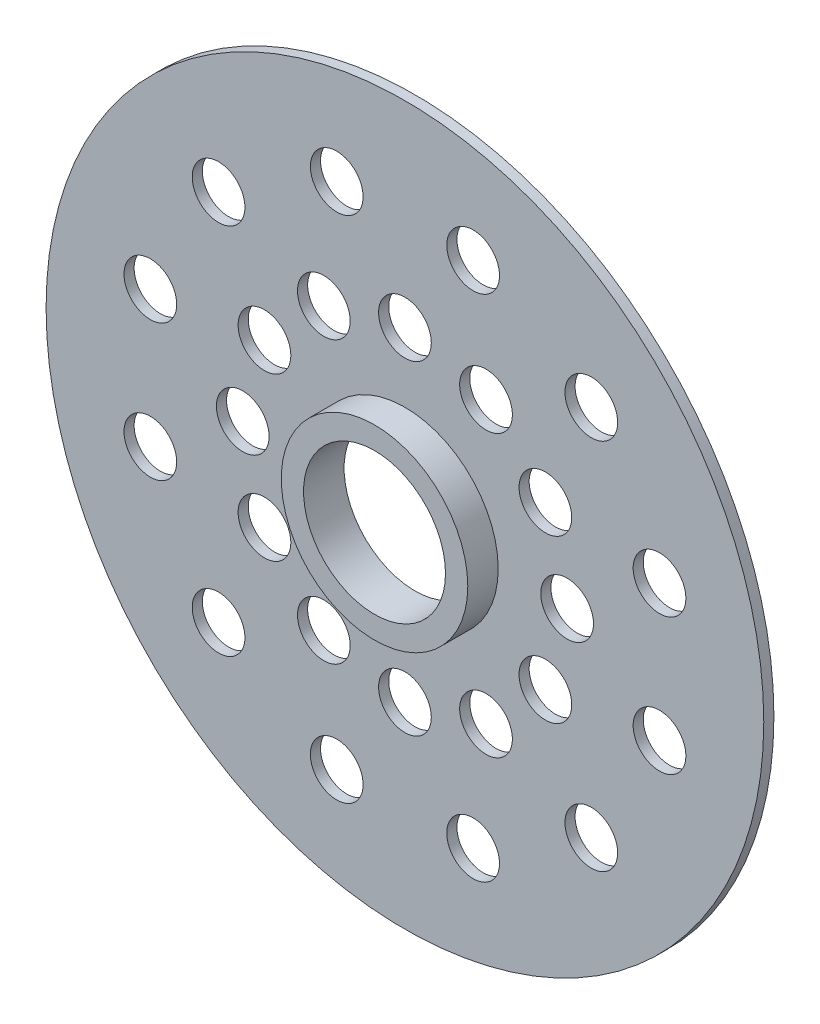
ISO-10303-21;
HEADER;
FILE_DESCRIPTION(('STEP AP214'),'2;1');
FILE_NAME('part.step','',(''),(''),'','','');
FILE_SCHEMA(('AUTOMOTIVE_DESIGN { 1 0 10303 214 1 1 1 1 }'));
ENDSEC;
DATA;
#1=APPLICATION_CONTEXT('core data for automotive mechanical design processes');
#2=APPLICATION_PROTOCOL_DEFINITION('international standard','automotive_design',2000,#1);
#3=PRODUCT_CONTEXT('',#1,'mechanical');
#4=PRODUCT('Part','Part','',(#3));
#5=PRODUCT_RELATED_PRODUCT_CATEGORY('part','',(#4));
#6=PRODUCT_DEFINITION_FORMATION('','',#4);
#7=PRODUCT_DEFINITION_CONTEXT('part definition',#1,'design');
#8=PRODUCT_DEFINITION('design','',#6,#7);
#9=PRODUCT_DEFINITION_SHAPE('','',#8);
#10=(LENGTH_UNIT() NAMED_UNIT(*) SI_UNIT(.MILLI.,.METRE.));
#11=(NAMED_UNIT(*) PLANE_ANGLE_UNIT() SI_UNIT($,.RADIAN.));
#12=(NAMED_UNIT(*) SI_UNIT($,.STERADIAN.) SOLID_ANGLE_UNIT());
#13=UNCERTAINTY_MEASURE_WITH_UNIT(LENGTH_MEASURE(1.E-05),#10,'distance_accuracy_value','');
#14=(GEOMETRIC_REPRESENTATION_CONTEXT(3) GLOBAL_UNCERTAINTY_ASSIGNED_CONTEXT((#13)) GLOBAL_UNIT_ASSIGNED_CONTEXT((#10,
#11,#12)) REPRESENTATION_CONTEXT('',''));
#15=CARTESIAN_POINT('',(0.,0.,0.));
#16=DIRECTION('',(0.,0.,1.));
#17=DIRECTION('',(1.,0.,0.));
#18=AXIS2_PLACEMENT_3D('',#15,#16,#17);
#19=CARTESIAN_POINT('',(0.,0.,-39.5));
#20=DIRECTION('',(0.,0.,1.));
#21=DIRECTION('',(1.,0.,0.));
#22=AXIS2_PLACEMENT_3D('',#19,#20,#21);
#23=PLANE('',#22);
#24=CARTESIAN_POINT('',(-45.9619407771256,45.9619407771256,-39.5));
#25=DIRECTION('',(0.,0.,1.));
#26=DIRECTION('',(1.,0.,0.));
#27=AXIS2_PLACEMENT_3D('',#24,#25,#26);
#28=CIRCLE('',#27,6.5);
#29=CARTESIAN_POINT('',(-39.4619407771256,45.9619407771256,-39.5));
#30=VERTEX_POINT('',#29);
#31=EDGE_CURVE('E184',#30,#30,#28,.T.);
#32=ORIENTED_EDGE('',*,*,#31,.F.);
#33=EDGE_LOOP('',(#32));
#34=FACE_BOUND('',#33,.T.);
#35=CARTESIAN_POINT('',(-16.8232379316639,62.7851787087894,-39.5));
#36=DIRECTION('',(0.,0.,1.));
#37=DIRECTION('',(1.,0.,0.));
#38=AXIS2_PLACEMENT_3D('',#35,#36,#37);
#39=CIRCLE('',#38,6.5);
#40=CARTESIAN_POINT('',(-10.3232379316639,62.7851787087894,-39.5));
#41=VERTEX_POINT('',#40);
#42=EDGE_CURVE('E168',#41,#41,#39,.T.);
#43=ORIENTED_EDGE('',*,*,#42,.F.);
#44=EDGE_LOOP('',(#43));
#45=FACE_BOUND('',#44,.T.);
#46=CARTESIAN_POINT('',(16.8232379316638,62.7851787087894,-39.5));
#47=DIRECTION('',(0.,0.,1.));
#48=DIRECTION('',(1.,0.,0.));
#49=AXIS2_PLACEMENT_3D('',#46,#47,#48);
#50=CIRCLE('',#49,6.5);
#51=CARTESIAN_POINT('',(23.3232379316638,62.7851787087894,-39.5));
#52=VERTEX_POINT('',#51);
#53=EDGE_CURVE('E164',#52,#52,#50,.T.);
#54=ORIENTED_EDGE('',*,*,#53,.F.);
#55=EDGE_LOOP('',(#54));
#56=FACE_BOUND('',#55,.T.);
#57=CARTESIAN_POINT('',(45.9619407771256,45.9619407771256,-39.5));
#58=DIRECTION('',(0.,0.,1.));
#59=DIRECTION('',(1.,0.,0.));
#60=AXIS2_PLACEMENT_3D('',#57,#58,#59);
#61=CIRCLE('',#60,6.5);
#62=CARTESIAN_POINT('',(52.4619407771256,45.9619407771256,-39.5));
#63=VERTEX_POINT('',#62);
#64=EDGE_CURVE('E160',#63,#63,#61,.T.);
#65=ORIENTED_EDGE('',*,*,#64,.F.);
#66=EDGE_LOOP('',(#65));
#67=FACE_BOUND('',#66,.T.);
#68=CARTESIAN_POINT('',(62.7851787087894,16.8232379316638,-39.5));
#69=DIRECTION('',(0.,0.,1.));
#70=DIRECTION('',(1.,0.,0.));
#71=AXIS2_PLACEMENT_3D('',#68,#69,#70);
#72=CIRCLE('',#71,6.50000000000001);
#73=CARTESIAN_POINT('',(69.2851787087894,16.8232379316638,-39.5));
#74=VERTEX_POINT('',#73);
#75=EDGE_CURVE('E155',#74,#74,#72,.T.);
#76=ORIENTED_EDGE('',*,*,#75,.F.);
#77=EDGE_LOOP('',(#76));
#78=FACE_BOUND('',#77,.T.);
#79=CARTESIAN_POINT('',(34.6410161513775,-20.,-39.5));
#80=DIRECTION('',(0.,0.,1.));
#81=DIRECTION('',(1.,0.,0.));
#82=AXIS2_PLACEMENT_3D('',#79,#80,#81);
#83=CIRCLE('',#82,6.5);
#84=CARTESIAN_POINT('',(41.1410161513775,-20.,-39.5));
#85=VERTEX_POINT('',#84);
#86=EDGE_CURVE('E150',#85,#85,#83,.T.);
#87=ORIENTED_EDGE('',*,*,#86,.F.);
#88=EDGE_LOOP('',(#87));
#89=FACE_BOUND('',#88,.T.);
#90=CARTESIAN_POINT('',(20.,-34.6410161513775,-39.5));
#91=DIRECTION('',(0.,0.,1.));
#92=DIRECTION('',(1.,0.,0.));
#93=AXIS2_PLACEMENT_3D('',#90,#91,#92);
#94=CIRCLE('',#93,6.5);
#95=CARTESIAN_POINT('',(26.5,-34.6410161513775,-39.5));
#96=VERTEX_POINT('',#95);
#97=EDGE_CURVE('E145',#96,#96,#94,.T.);
#98=ORIENTED_EDGE('',*,*,#97,.F.);
#99=EDGE_LOOP('',(#98));
#100=FACE_BOUND('',#99,.T.);
#101=CARTESIAN_POINT('',(0.,-40.,-39.5));
#102=DIRECTION('',(0.,0.,1.));
#103=DIRECTION('',(1.,0.,0.));
#104=AXIS2_PLACEMENT_3D('',#101,#102,#103);
#105=CIRCLE('',#104,6.5);
#106=CARTESIAN_POINT('',(6.49999999999999,-40.,-39.5));
#107=VERTEX_POINT('',#106);
#108=EDGE_CURVE('E140',#107,#107,#105,.T.);
#109=ORIENTED_EDGE('',*,*,#108,.F.);
#110=EDGE_LOOP('',(#109));
#111=FACE_BOUND('',#110,.T.);
#112=CARTESIAN_POINT('',(34.6410161513775,20.,-39.5));
#113=DIRECTION('',(0.,0.,1.));
#114=DIRECTION('',(1.,0.,0.));
#115=AXIS2_PLACEMENT_3D('',#112,#113,#114);
#116=CIRCLE('',#115,6.5);
#117=CARTESIAN_POINT('',(41.1410161513775,20.,-39.5));
#118=VERTEX_POINT('',#117);
#119=EDGE_CURVE('E135',#118,#118,#116,.T.);
#120=ORIENTED_EDGE('',*,*,#119,.F.);
#121=EDGE_LOOP('',(#120));
#122=FACE_BOUND('',#121,.T.);
#123=CARTESIAN_POINT('',(20.,34.6410161513775,-39.5));
#124=DIRECTION('',(0.,0.,1.));
#125=DIRECTION('',(1.,0.,0.));
#126=AXIS2_PLACEMENT_3D('',#123,#124,#125);
#127=CIRCLE('',#126,6.5);
#128=CARTESIAN_POINT('',(26.5,34.6410161513775,-39.5));
#129=VERTEX_POINT('',#128);
#130=EDGE_CURVE('E131',#129,#129,#127,.T.);
#131=ORIENTED_EDGE('',*,*,#130,.F.);
#132=EDGE_LOOP('',(#131));
#133=FACE_BOUND('',#132,.T.);
#134=CARTESIAN_POINT('',(0.,40.,-39.5));
#135=DIRECTION('',(0.,0.,1.));
#136=DIRECTION('',(1.,0.,0.));
#137=AXIS2_PLACEMENT_3D('',#134,#135,#136);
#138=CIRCLE('',#137,6.5);
#139=CARTESIAN_POINT('',(6.5,40.,-39.5));
#140=VERTEX_POINT('',#139);
#141=EDGE_CURVE('E126',#140,#140,#138,.T.);
#142=ORIENTED_EDGE('',*,*,#141,.F.);
#143=EDGE_LOOP('',(#142));
#144=FACE_BOUND('',#143,.T.);
#145=CARTESIAN_POINT('',(-20.,34.6410161513775,-39.5));
#146=DIRECTION('',(0.,0.,1.));
#147=DIRECTION('',(1.,0.,0.));
#148=AXIS2_PLACEMENT_3D('',#145,#146,#147);
#149=CIRCLE('',#148,6.5);
#150=CARTESIAN_POINT('',(-13.5,34.6410161513775,-39.5));
#151=VERTEX_POINT('',#150);
#152=EDGE_CURVE('E121',#151,#151,#149,.T.);
#153=ORIENTED_EDGE('',*,*,#152,.F.);
#154=EDGE_LOOP('',(#153));
#155=FACE_BOUND('',#154,.T.);
#156=CARTESIAN_POINT('',(-34.6410161513775,20.,-39.5));
#157=DIRECTION('',(0.,0.,1.));
#158=DIRECTION('',(1.,0.,0.));
#159=AXIS2_PLACEMENT_3D('',#156,#157,#158);
#160=CIRCLE('',#159,6.5);
#161=CARTESIAN_POINT('',(-28.1410161513775,20.,-39.5));
#162=VERTEX_POINT('',#161);
#163=EDGE_CURVE('E116',#162,#162,#160,.T.);
#164=ORIENTED_EDGE('',*,*,#163,.F.);
#165=EDGE_LOOP('',(#164));
#166=FACE_BOUND('',#165,.T.);
#167=CARTESIAN_POINT('',(-40.,0.,-39.5));
#168=DIRECTION('',(0.,0.,1.));
#169=DIRECTION('',(1.,0.,0.));
#170=AXIS2_PLACEMENT_3D('',#167,#168,#169);
#171=CIRCLE('',#170,6.5);
#172=CARTESIAN_POINT('',(-33.5,0.,-39.5));
#173=VERTEX_POINT('',#172);
#174=EDGE_CURVE('E111',#173,#173,#171,.T.);
#175=ORIENTED_EDGE('',*,*,#174,.F.);
#176=EDGE_LOOP('',(#175));
#177=FACE_BOUND('',#176,.T.);
#178=CARTESIAN_POINT('',(-34.6410161513775,-20.,-39.5));
#179=DIRECTION('',(0.,0.,1.));
#180=DIRECTION('',(1.,0.,0.));
#181=AXIS2_PLACEMENT_3D('',#178,#179,#180);
#182=CIRCLE('',#181,6.5);
#183=CARTESIAN_POINT('',(-28.1410161513775,-20.,-39.5));
#184=VERTEX_POINT('',#183);
#185=EDGE_CURVE('E106',#184,#184,#182,.T.);
#186=ORIENTED_EDGE('',*,*,#185,.F.);
#187=EDGE_LOOP('',(#186));
#188=FACE_BOUND('',#187,.T.);
#189=CARTESIAN_POINT('',(-20.,-34.6410161513775,-39.5));
#190=DIRECTION('',(0.,0.,1.));
#191=DIRECTION('',(1.,0.,0.));
#192=AXIS2_PLACEMENT_3D('',#189,#190,#191);
#193=CIRCLE('',#192,6.5);
#194=CARTESIAN_POINT('',(-13.5,-34.6410161513775,-39.5));
#195=VERTEX_POINT('',#194);
#196=EDGE_CURVE('E101',#195,#195,#193,.T.);
#197=ORIENTED_EDGE('',*,*,#196,.F.);
#198=EDGE_LOOP('',(#197));
#199=FACE_BOUND('',#198,.T.);
#200=CARTESIAN_POINT('',(-62.7851787087894,16.8232379316639,-39.5));
#201=DIRECTION('',(0.,0.,1.));
#202=DIRECTION('',(1.,0.,0.));
#203=AXIS2_PLACEMENT_3D('',#200,#201,#202);
#204=CIRCLE('',#203,6.5);
#205=CARTESIAN_POINT('',(-56.2851787087894,16.8232379316639,-39.5));
#206=VERTEX_POINT('',#205);
#207=EDGE_CURVE('E96',#206,#206,#204,.T.);
#208=ORIENTED_EDGE('',*,*,#207,.F.);
#209=EDGE_LOOP('',(#208));
#210=FACE_BOUND('',#209,.T.);
#211=CARTESIAN_POINT('',(-62.7851787087894,-16.8232379316638,-39.5));
#212=DIRECTION('',(0.,0.,1.));
#213=DIRECTION('',(1.,0.,0.));
#214=AXIS2_PLACEMENT_3D('',#211,#212,#213);
#215=CIRCLE('',#214,6.5);
#216=CARTESIAN_POINT('',(-56.2851787087894,-16.8232379316638,-39.5));
#217=VERTEX_POINT('',#216);
#218=EDGE_CURVE('E91',#217,#217,#215,.T.);
#219=ORIENTED_EDGE('',*,*,#218,.F.);
#220=EDGE_LOOP('',(#219));
#221=FACE_BOUND('',#220,.T.);
#222=CARTESIAN_POINT('',(-45.9619407771256,-45.9619407771256,-39.5));
#223=DIRECTION('',(0.,0.,1.));
#224=DIRECTION('',(1.,0.,0.));
#225=AXIS2_PLACEMENT_3D('',#222,#223,#224);
#226=CIRCLE('',#225,6.5);
#227=CARTESIAN_POINT('',(-39.4619407771256,-45.9619407771256,-39.5));
#228=VERTEX_POINT('',#227);
#229=EDGE_CURVE('E86',#228,#228,#226,.T.);
#230=ORIENTED_EDGE('',*,*,#229,.F.);
#231=EDGE_LOOP('',(#230));
#232=FACE_BOUND('',#231,.T.);
#233=CARTESIAN_POINT('',(-16.8232379316638,-62.7851787087894,-39.5));
#234=DIRECTION('',(0.,0.,1.));
#235=DIRECTION('',(1.,0.,0.));
#236=AXIS2_PLACEMENT_3D('',#233,#234,#235);
#237=CIRCLE('',#236,6.5);
#238=CARTESIAN_POINT('',(-10.3232379316638,-62.7851787087894,-39.5));
#239=VERTEX_POINT('',#238);
#240=EDGE_CURVE('E81',#239,#239,#237,.T.);
#241=ORIENTED_EDGE('',*,*,#240,.F.);
#242=EDGE_LOOP('',(#241));
#243=FACE_BOUND('',#242,.T.);
#244=CARTESIAN_POINT('',(16.8232379316639,-62.7851787087894,-39.5));
#245=DIRECTION('',(0.,0.,1.));
#246=DIRECTION('',(1.,0.,0.));
#247=AXIS2_PLACEMENT_3D('',#244,#245,#246);
#248=CIRCLE('',#247,6.5);
#249=CARTESIAN_POINT('',(23.3232379316639,-62.7851787087894,-39.5));
#250=VERTEX_POINT('',#249);
#251=EDGE_CURVE('E76',#250,#250,#248,.T.);
#252=ORIENTED_EDGE('',*,*,#251,.F.);
#253=EDGE_LOOP('',(#252));
#254=FACE_BOUND('',#253,.T.);
#255=CARTESIAN_POINT('',(45.9619407771256,-45.9619407771256,-39.5));
#256=DIRECTION('',(0.,0.,1.));
#257=DIRECTION('',(1.,0.,0.));
#258=AXIS2_PLACEMENT_3D('',#255,#256,#257);
#259=CIRCLE('',#258,6.5);
#260=CARTESIAN_POINT('',(52.4619407771256,-45.9619407771256,-39.5));
#261=VERTEX_POINT('',#260);
#262=EDGE_CURVE('E71',#261,#261,#259,.T.);
#263=ORIENTED_EDGE('',*,*,#262,.F.);
#264=EDGE_LOOP('',(#263));
#265=FACE_BOUND('',#264,.T.);
#266=CARTESIAN_POINT('',(62.7851787087894,-16.8232379316638,-39.5));
#267=DIRECTION('',(0.,0.,1.));
#268=DIRECTION('',(1.,0.,0.));
#269=AXIS2_PLACEMENT_3D('',#266,#267,#268);
#270=CIRCLE('',#269,6.50000000000001);
#271=CARTESIAN_POINT('',(69.2851787087894,-16.8232379316638,-39.5));
#272=VERTEX_POINT('',#271);
#273=EDGE_CURVE('E66',#272,#272,#270,.T.);
#274=ORIENTED_EDGE('',*,*,#273,.F.);
#275=EDGE_LOOP('',(#274));
#276=FACE_BOUND('',#275,.T.);
#277=CARTESIAN_POINT('',(40.,0.,-39.5));
#278=DIRECTION('',(0.,0.,1.));
#279=DIRECTION('',(1.,0.,0.));
#280=AXIS2_PLACEMENT_3D('',#277,#278,#279);
#281=CIRCLE('',#280,6.5);
#282=CARTESIAN_POINT('',(46.5,0.,-39.5));
#283=VERTEX_POINT('',#282);
#284=EDGE_CURVE('E61',#283,#283,#281,.T.);
#285=ORIENTED_EDGE('',*,*,#284,.F.);
#286=EDGE_LOOP('',(#285));
#287=FACE_BOUND('',#286,.T.);
#288=CARTESIAN_POINT('',(0.,0.,-39.5));
#289=DIRECTION('',(0.,0.,1.));
#290=DIRECTION('',(1.,0.,0.));
#291=AXIS2_PLACEMENT_3D('',#288,#289,#290);
#292=CIRCLE('',#291,88.5);
#293=CARTESIAN_POINT('',(88.5,0.,-39.5));
#294=VERTEX_POINT('',#293);
#295=EDGE_CURVE('E10',#294,#294,#292,.T.);
#296=ORIENTED_EDGE('',*,*,#295,.T.);
#297=EDGE_LOOP('',(#296));
#298=FACE_BOUND('',#297,.T.);
#299=CARTESIAN_POINT('',(0.,0.,-39.5));
#300=DIRECTION('',(0.,0.,1.));
#301=DIRECTION('',(1.,0.,0.));
#302=AXIS2_PLACEMENT_3D('',#299,#300,#301);
#303=CIRCLE('',#302,23.);
#304=CARTESIAN_POINT('',(23.,0.,-39.5));
#305=VERTEX_POINT('',#304);
#306=EDGE_CURVE('E195',#305,#305,#303,.F.);
#307=ORIENTED_EDGE('',*,*,#306,.T.);
#308=EDGE_LOOP('',(#307));
#309=FACE_BOUND('',#308,.T.);
#310=ADVANCED_FACE('F36',(#34,#45,#56,#67,#78,#89,#100,#111,#122,#133,#144,#155,#166,#177,#188,
#199,#210,#221,#232,#243,#254,#265,#276,#287,#298,#309),#23,.T.);
#311=CARTESIAN_POINT('',(0.,0.,-42.));
#312=DIRECTION('',(0.,0.,1.));
#313=DIRECTION('',(1.,0.,0.));
#314=AXIS2_PLACEMENT_3D('',#311,#312,#313);
#315=PLANE('',#314);
#316=CARTESIAN_POINT('',(-45.9619407771256,45.9619407771256,-42.));
#317=DIRECTION('',(0.,0.,1.));
#318=DIRECTION('',(1.,0.,0.));
#319=AXIS2_PLACEMENT_3D('',#316,#317,#318);
#320=CIRCLE('',#319,6.5);
#321=CARTESIAN_POINT('',(-39.4619407771256,45.9619407771256,-42.));
#322=VERTEX_POINT('',#321);
#323=EDGE_CURVE('E40',#322,#322,#320,.T.);
#324=ORIENTED_EDGE('',*,*,#323,.T.);
#325=EDGE_LOOP('',(#324));
#326=FACE_BOUND('',#325,.T.);
#327=CARTESIAN_POINT('',(-16.8232379316639,62.7851787087894,-42.));
#328=DIRECTION('',(0.,0.,1.));
#329=DIRECTION('',(1.,0.,0.));
#330=AXIS2_PLACEMENT_3D('',#327,#328,#329);
#331=CIRCLE('',#330,6.5);
#332=CARTESIAN_POINT('',(-10.3232379316639,62.7851787087894,-42.));
#333=VERTEX_POINT('',#332);
#334=EDGE_CURVE('E165',#333,#333,#331,.T.);
#335=ORIENTED_EDGE('',*,*,#334,.T.);
#336=EDGE_LOOP('',(#335));
#337=FACE_BOUND('',#336,.T.);
#338=CARTESIAN_POINT('',(16.8232379316638,62.7851787087894,-42.));
#339=DIRECTION('',(0.,0.,1.));
#340=DIRECTION('',(1.,0.,0.));
#341=AXIS2_PLACEMENT_3D('',#338,#339,#340);
#342=CIRCLE('',#341,6.5);
#343=CARTESIAN_POINT('',(23.3232379316638,62.7851787087894,-42.));
#344=VERTEX_POINT('',#343);
#345=EDGE_CURVE('E161',#344,#344,#342,.T.);
#346=ORIENTED_EDGE('',*,*,#345,.T.);
#347=EDGE_LOOP('',(#346));
#348=FACE_BOUND('',#347,.T.);
#349=CARTESIAN_POINT('',(45.9619407771256,45.9619407771256,-42.));
#350=DIRECTION('',(0.,0.,1.));
#351=DIRECTION('',(1.,0.,0.));
#352=AXIS2_PLACEMENT_3D('',#349,#350,#351);
#353=CIRCLE('',#352,6.5);
#354=CARTESIAN_POINT('',(52.4619407771256,45.9619407771256,-42.));
#355=VERTEX_POINT('',#354);
#356=EDGE_CURVE('E156',#355,#355,#353,.T.);
#357=ORIENTED_EDGE('',*,*,#356,.T.);
#358=EDGE_LOOP('',(#357));
#359=FACE_BOUND('',#358,.T.);
#360=CARTESIAN_POINT('',(62.7851787087894,16.8232379316638,-42.));
#361=DIRECTION('',(0.,0.,1.));
#362=DIRECTION('',(1.,0.,0.));
#363=AXIS2_PLACEMENT_3D('',#360,#361,#362);
#364=CIRCLE('',#363,6.50000000000001);
#365=CARTESIAN_POINT('',(69.2851787087894,16.8232379316638,-42.));
#366=VERTEX_POINT('',#365);
#367=EDGE_CURVE('E151',#366,#366,#364,.T.);
#368=ORIENTED_EDGE('',*,*,#367,.T.);
#369=EDGE_LOOP('',(#368));
#370=FACE_BOUND('',#369,.T.);
#371=CARTESIAN_POINT('',(34.6410161513775,-20.,-42.));
#372=DIRECTION('',(0.,0.,1.));
#373=DIRECTION('',(1.,0.,0.));
#374=AXIS2_PLACEMENT_3D('',#371,#372,#373);
#375=CIRCLE('',#374,6.5);
#376=CARTESIAN_POINT('',(41.1410161513775,-20.,-42.));
#377=VERTEX_POINT('',#376);
#378=EDGE_CURVE('E146',#377,#377,#375,.T.);
#379=ORIENTED_EDGE('',*,*,#378,.T.);
#380=EDGE_LOOP('',(#379));
#381=FACE_BOUND('',#380,.T.);
#382=CARTESIAN_POINT('',(20.,-34.6410161513775,-42.));
#383=DIRECTION('',(0.,0.,1.));
#384=DIRECTION('',(1.,0.,0.));
#385=AXIS2_PLACEMENT_3D('',#382,#383,#384);
#386=CIRCLE('',#385,6.5);
#387=CARTESIAN_POINT('',(26.5,-34.6410161513775,-42.));
#388=VERTEX_POINT('',#387);
#389=EDGE_CURVE('E141',#388,#388,#386,.T.);
#390=ORIENTED_EDGE('',*,*,#389,.T.);
#391=EDGE_LOOP('',(#390));
#392=FACE_BOUND('',#391,.T.);
#393=CARTESIAN_POINT('',(0.,-40.,-42.));
#394=DIRECTION('',(0.,0.,1.));
#395=DIRECTION('',(1.,0.,0.));
#396=AXIS2_PLACEMENT_3D('',#393,#394,#395);
#397=CIRCLE('',#396,6.5);
#398=CARTESIAN_POINT('',(6.49999999999999,-40.,-42.));
#399=VERTEX_POINT('',#398);
#400=EDGE_CURVE('E136',#399,#399,#397,.T.);
#401=ORIENTED_EDGE('',*,*,#400,.T.);
#402=EDGE_LOOP('',(#401));
#403=FACE_BOUND('',#402,.T.);
#404=CARTESIAN_POINT('',(34.6410161513775,20.,-42.));
#405=DIRECTION('',(0.,0.,1.));
#406=DIRECTION('',(1.,0.,0.));
#407=AXIS2_PLACEMENT_3D('',#404,#405,#406);
#408=CIRCLE('',#407,6.5);
#409=CARTESIAN_POINT('',(41.1410161513775,20.,-42.));
#410=VERTEX_POINT('',#409);
#411=EDGE_CURVE('E132',#410,#410,#408,.T.);
#412=ORIENTED_EDGE('',*,*,#411,.T.);
#413=EDGE_LOOP('',(#412));
#414=FACE_BOUND('',#413,.T.);
#415=CARTESIAN_POINT('',(20.,34.6410161513775,-42.));
#416=DIRECTION('',(0.,0.,1.));
#417=DIRECTION('',(1.,0.,0.));
#418=AXIS2_PLACEMENT_3D('',#415,#416,#417);
#419=CIRCLE('',#418,6.5);
#420=CARTESIAN_POINT('',(26.5,34.6410161513775,-42.));
#421=VERTEX_POINT('',#420);
#422=EDGE_CURVE('E127',#421,#421,#419,.T.);
#423=ORIENTED_EDGE('',*,*,#422,.T.);
#424=EDGE_LOOP('',(#423));
#425=FACE_BOUND('',#424,.T.);
#426=CARTESIAN_POINT('',(0.,40.,-42.));
#427=DIRECTION('',(0.,0.,1.));
#428=DIRECTION('',(1.,0.,0.));
#429=AXIS2_PLACEMENT_3D('',#426,#427,#428);
#430=CIRCLE('',#429,6.5);
#431=CARTESIAN_POINT('',(6.5,40.,-42.));
#432=VERTEX_POINT('',#431);
#433=EDGE_CURVE('E122',#432,#432,#430,.T.);
#434=ORIENTED_EDGE('',*,*,#433,.T.);
#435=EDGE_LOOP('',(#434));
#436=FACE_BOUND('',#435,.T.);
#437=CARTESIAN_POINT('',(-20.,34.6410161513775,-42.));
#438=DIRECTION('',(0.,0.,1.));
#439=DIRECTION('',(1.,0.,0.));
#440=AXIS2_PLACEMENT_3D('',#437,#438,#439);
#441=CIRCLE('',#440,6.5);
#442=CARTESIAN_POINT('',(-13.5,34.6410161513775,-42.));
#443=VERTEX_POINT('',#442);
#444=EDGE_CURVE('E117',#443,#443,#441,.T.);
#445=ORIENTED_EDGE('',*,*,#444,.T.);
#446=EDGE_LOOP('',(#445));
#447=FACE_BOUND('',#446,.T.);
#448=CARTESIAN_POINT('',(-34.6410161513775,20.,-42.));
#449=DIRECTION('',(0.,0.,1.));
#450=DIRECTION('',(1.,0.,0.));
#451=AXIS2_PLACEMENT_3D('',#448,#449,#450);
#452=CIRCLE('',#451,6.5);
#453=CARTESIAN_POINT('',(-28.1410161513775,20.,-42.));
#454=VERTEX_POINT('',#453);
#455=EDGE_CURVE('E112',#454,#454,#452,.T.);
#456=ORIENTED_EDGE('',*,*,#455,.T.);
#457=EDGE_LOOP('',(#456));
#458=FACE_BOUND('',#457,.T.);
#459=CARTESIAN_POINT('',(-40.,0.,-42.));
#460=DIRECTION('',(0.,0.,1.));
#461=DIRECTION('',(1.,0.,0.));
#462=AXIS2_PLACEMENT_3D('',#459,#460,#461);
#463=CIRCLE('',#462,6.5);
#464=CARTESIAN_POINT('',(-33.5,0.,-42.));
#465=VERTEX_POINT('',#464);
#466=EDGE_CURVE('E107',#465,#465,#463,.T.);
#467=ORIENTED_EDGE('',*,*,#466,.T.);
#468=EDGE_LOOP('',(#467));
#469=FACE_BOUND('',#468,.T.);
#470=CARTESIAN_POINT('',(-34.6410161513775,-20.,-42.));
#471=DIRECTION('',(0.,0.,1.));
#472=DIRECTION('',(1.,0.,0.));
#473=AXIS2_PLACEMENT_3D('',#470,#471,#472);
#474=CIRCLE('',#473,6.5);
#475=CARTESIAN_POINT('',(-28.1410161513775,-20.,-42.));
#476=VERTEX_POINT('',#475);
#477=EDGE_CURVE('E102',#476,#476,#474,.T.);
#478=ORIENTED_EDGE('',*,*,#477,.T.);
#479=EDGE_LOOP('',(#478));
#480=FACE_BOUND('',#479,.T.);
#481=CARTESIAN_POINT('',(-20.,-34.6410161513775,-42.));
#482=DIRECTION('',(0.,0.,1.));
#483=DIRECTION('',(1.,0.,0.));
#484=AXIS2_PLACEMENT_3D('',#481,#482,#483);
#485=CIRCLE('',#484,6.5);
#486=CARTESIAN_POINT('',(-13.5,-34.6410161513775,-42.));
#487=VERTEX_POINT('',#486);
#488=EDGE_CURVE('E97',#487,#487,#485,.T.);
#489=ORIENTED_EDGE('',*,*,#488,.T.);
#490=EDGE_LOOP('',(#489));
#491=FACE_BOUND('',#490,.T.);
#492=CARTESIAN_POINT('',(-62.7851787087894,16.8232379316639,-42.));
#493=DIRECTION('',(0.,0.,1.));
#494=DIRECTION('',(1.,0.,0.));
#495=AXIS2_PLACEMENT_3D('',#492,#493,#494);
#496=CIRCLE('',#495,6.5);
#497=CARTESIAN_POINT('',(-56.2851787087894,16.8232379316639,-42.));
#498=VERTEX_POINT('',#497);
#499=EDGE_CURVE('E92',#498,#498,#496,.T.);
#500=ORIENTED_EDGE('',*,*,#499,.T.);
#501=EDGE_LOOP('',(#500));
#502=FACE_BOUND('',#501,.T.);
#503=CARTESIAN_POINT('',(-62.7851787087894,-16.8232379316638,-42.));
#504=DIRECTION('',(0.,0.,1.));
#505=DIRECTION('',(1.,0.,0.));
#506=AXIS2_PLACEMENT_3D('',#503,#504,#505);
#507=CIRCLE('',#506,6.5);
#508=CARTESIAN_POINT('',(-56.2851787087894,-16.8232379316638,-42.));
#509=VERTEX_POINT('',#508);
#510=EDGE_CURVE('E87',#509,#509,#507,.T.);
#511=ORIENTED_EDGE('',*,*,#510,.T.);
#512=EDGE_LOOP('',(#511));
#513=FACE_BOUND('',#512,.T.);
#514=CARTESIAN_POINT('',(-45.9619407771256,-45.9619407771256,-42.));
#515=DIRECTION('',(0.,0.,1.));
#516=DIRECTION('',(1.,0.,0.));
#517=AXIS2_PLACEMENT_3D('',#514,#515,#516);
#518=CIRCLE('',#517,6.5);
#519=CARTESIAN_POINT('',(-39.4619407771256,-45.9619407771256,-42.));
#520=VERTEX_POINT('',#519);
#521=EDGE_CURVE('E82',#520,#520,#518,.T.);
#522=ORIENTED_EDGE('',*,*,#521,.T.);
#523=EDGE_LOOP('',(#522));
#524=FACE_BOUND('',#523,.T.);
#525=CARTESIAN_POINT('',(-16.8232379316638,-62.7851787087894,-42.));
#526=DIRECTION('',(0.,0.,1.));
#527=DIRECTION('',(1.,0.,0.));
#528=AXIS2_PLACEMENT_3D('',#525,#526,#527);
#529=CIRCLE('',#528,6.5);
#530=CARTESIAN_POINT('',(-10.3232379316638,-62.7851787087894,-42.));
#531=VERTEX_POINT('',#530);
#532=EDGE_CURVE('E77',#531,#531,#529,.T.);
#533=ORIENTED_EDGE('',*,*,#532,.T.);
#534=EDGE_LOOP('',(#533));
#535=FACE_BOUND('',#534,.T.);
#536=CARTESIAN_POINT('',(16.8232379316639,-62.7851787087894,-42.));
#537=DIRECTION('',(0.,0.,1.));
#538=DIRECTION('',(1.,0.,0.));
#539=AXIS2_PLACEMENT_3D('',#536,#537,#538);
#540=CIRCLE('',#539,6.5);
#541=CARTESIAN_POINT('',(23.3232379316639,-62.7851787087894,-42.));
#542=VERTEX_POINT('',#541);
#543=EDGE_CURVE('E72',#542,#542,#540,.T.);
#544=ORIENTED_EDGE('',*,*,#543,.T.);
#545=EDGE_LOOP('',(#544));
#546=FACE_BOUND('',#545,.T.);
#547=CARTESIAN_POINT('',(45.9619407771256,-45.9619407771256,-42.));
#548=DIRECTION('',(0.,0.,1.));
#549=DIRECTION('',(1.,0.,0.));
#550=AXIS2_PLACEMENT_3D('',#547,#548,#549);
#551=CIRCLE('',#550,6.5);
#552=CARTESIAN_POINT('',(52.4619407771256,-45.9619407771256,-42.));
#553=VERTEX_POINT('',#552);
#554=EDGE_CURVE('E67',#553,#553,#551,.T.);
#555=ORIENTED_EDGE('',*,*,#554,.T.);
#556=EDGE_LOOP('',(#555));
#557=FACE_BOUND('',#556,.T.);
#558=CARTESIAN_POINT('',(62.7851787087894,-16.8232379316638,-42.));
#559=DIRECTION('',(0.,0.,1.));
#560=DIRECTION('',(1.,0.,0.));
#561=AXIS2_PLACEMENT_3D('',#558,#559,#560);
#562=CIRCLE('',#561,6.50000000000001);
#563=CARTESIAN_POINT('',(69.2851787087894,-16.8232379316638,-42.));
#564=VERTEX_POINT('',#563);
#565=EDGE_CURVE('E62',#564,#564,#562,.T.);
#566=ORIENTED_EDGE('',*,*,#565,.T.);
#567=EDGE_LOOP('',(#566));
#568=FACE_BOUND('',#567,.T.);
#569=CARTESIAN_POINT('',(40.,0.,-42.));
#570=DIRECTION('',(0.,0.,1.));
#571=DIRECTION('',(1.,0.,0.));
#572=AXIS2_PLACEMENT_3D('',#569,#570,#571);
#573=CIRCLE('',#572,6.5);
#574=CARTESIAN_POINT('',(46.5,0.,-42.));
#575=VERTEX_POINT('',#574);
#576=EDGE_CURVE('E57',#575,#575,#573,.T.);
#577=ORIENTED_EDGE('',*,*,#576,.T.);
#578=EDGE_LOOP('',(#577));
#579=FACE_BOUND('',#578,.T.);
#580=CARTESIAN_POINT('',(0.,0.,-42.));
#581=DIRECTION('',(0.,0.,1.));
#582=DIRECTION('',(1.,0.,0.));
#583=AXIS2_PLACEMENT_3D('',#580,#581,#582);
#584=CIRCLE('',#583,17.5);
#585=CARTESIAN_POINT('',(17.5,0.,-42.));
#586=VERTEX_POINT('',#585);
#587=EDGE_CURVE('E52',#586,#586,#584,.T.);
#588=ORIENTED_EDGE('',*,*,#587,.T.);
#589=EDGE_LOOP('',(#588));
#590=FACE_BOUND('',#589,.T.);
#591=CARTESIAN_POINT('',(0.,0.,-42.));
#592=DIRECTION('',(0.,0.,1.));
#593=DIRECTION('',(1.,0.,0.));
#594=AXIS2_PLACEMENT_3D('',#591,#592,#593);
#595=CIRCLE('',#594,88.5);
#596=CARTESIAN_POINT('',(88.5,0.,-42.));
#597=VERTEX_POINT('',#596);
#598=EDGE_CURVE('E45',#597,#597,#595,.T.);
#599=ORIENTED_EDGE('',*,*,#598,.F.);
#600=EDGE_LOOP('',(#599));
#601=FACE_BOUND('',#600,.T.);
#602=ADVANCED_FACE('F206',(#326,#337,#348,#359,#370,#381,#392,#403,#414,#425,#436,#447,#458,
#469,#480,#491,#502,#513,#524,#535,#546,#557,#568,#579,#590,#601),#315,.F.);
#603=CARTESIAN_POINT('',(0.,0.,-39.5));
#604=DIRECTION('',(0.,0.,-1.));
#605=DIRECTION('',(-1.,0.,0.));
#606=AXIS2_PLACEMENT_3D('',#603,#604,#605);
#607=CYLINDRICAL_SURFACE('',#606,88.5);
#608=ORIENTED_EDGE('',*,*,#295,.F.);
#609=EDGE_LOOP('',(#608));
#610=FACE_BOUND('',#609,.T.);
#611=ORIENTED_EDGE('',*,*,#598,.T.);
#612=EDGE_LOOP('',(#611));
#613=FACE_BOUND('',#612,.T.);
#614=ADVANCED_FACE('F38',(#610,#613),#607,.T.);
#615=CARTESIAN_POINT('',(0.,0.,-39.5));
#616=DIRECTION('',(0.,0.,-1.));
#617=DIRECTION('',(-1.,0.,0.));
#618=AXIS2_PLACEMENT_3D('',#615,#616,#617);
#619=CYLINDRICAL_SURFACE('',#618,17.5);
#620=ORIENTED_EDGE('',*,*,#587,.F.);
#621=EDGE_LOOP('',(#620));
#622=FACE_BOUND('',#621,.T.);
#623=CARTESIAN_POINT('',(0.,0.,-32.));
#624=DIRECTION('',(0.,0.,1.));
#625=DIRECTION('',(1.,0.,0.));
#626=AXIS2_PLACEMENT_3D('',#623,#624,#625);
#627=CIRCLE('',#626,17.5);
#628=CARTESIAN_POINT('',(17.5,0.,-32.));
#629=VERTEX_POINT('',#628);
#630=EDGE_CURVE('E188',#629,#629,#627,.T.);
#631=ORIENTED_EDGE('',*,*,#630,.T.);
#632=EDGE_LOOP('',(#631));
#633=FACE_BOUND('',#632,.T.);
#634=ADVANCED_FACE('F209',(#622,#633),#619,.F.);
#635=CARTESIAN_POINT('',(0.,0.,-32.));
#636=DIRECTION('',(0.,0.,1.));
#637=DIRECTION('',(1.,0.,0.));
#638=AXIS2_PLACEMENT_3D('',#635,#636,#637);
#639=PLANE('',#638);
#640=CARTESIAN_POINT('',(0.,0.,-32.));
#641=DIRECTION('',(0.,0.,1.));
#642=DIRECTION('',(1.,0.,0.));
#643=AXIS2_PLACEMENT_3D('',#640,#641,#642);
#644=CIRCLE('',#643,23.);
#645=CARTESIAN_POINT('',(23.,0.,-32.));
#646=VERTEX_POINT('',#645);
#647=EDGE_CURVE('E192',#646,#646,#644,.T.);
#648=ORIENTED_EDGE('',*,*,#647,.T.);
#649=EDGE_LOOP('',(#648));
#650=FACE_BOUND('',#649,.T.);
#651=ORIENTED_EDGE('',*,*,#630,.F.);
#652=EDGE_LOOP('',(#651));
#653=FACE_BOUND('',#652,.T.);
#654=ADVANCED_FACE('F212',(#650,#653),#639,.T.);
#655=CARTESIAN_POINT('',(0.,0.,-32.));
#656=DIRECTION('',(0.,0.,-1.));
#657=DIRECTION('',(-1.,0.,0.));
#658=AXIS2_PLACEMENT_3D('',#655,#656,#657);
#659=CYLINDRICAL_SURFACE('',#658,23.);
#660=ORIENTED_EDGE('',*,*,#306,.F.);
#661=EDGE_LOOP('',(#660));
#662=FACE_BOUND('',#661,.T.);
#663=ORIENTED_EDGE('',*,*,#647,.F.);
#664=EDGE_LOOP('',(#663));
#665=FACE_BOUND('',#664,.T.);
#666=ADVANCED_FACE('F217',(#662,#665),#659,.T.);
#667=CARTESIAN_POINT('',(40.,0.,-100.));
#668=DIRECTION('',(0.,0.,1.));
#669=DIRECTION('',(1.,0.,0.));
#670=AXIS2_PLACEMENT_3D('',#667,#668,#669);
#671=CYLINDRICAL_SURFACE('',#670,6.5);
#672=ORIENTED_EDGE('',*,*,#284,.T.);
#673=EDGE_LOOP('',(#672));
#674=FACE_BOUND('',#673,.T.);
#675=ORIENTED_EDGE('',*,*,#576,.F.);
#676=EDGE_LOOP('',(#675));
#677=FACE_BOUND('',#676,.T.);
#678=ADVANCED_FACE('F223',(#674,#677),#671,.F.);
#679=CARTESIAN_POINT('',(62.7851787087894,-16.8232379316638,-100.));
#680=DIRECTION('',(0.,0.,1.));
#681=DIRECTION('',(1.,0.,0.));
#682=AXIS2_PLACEMENT_3D('',#679,#680,#681);
#683=CYLINDRICAL_SURFACE('',#682,6.50000000000001);
#684=ORIENTED_EDGE('',*,*,#273,.T.);
#685=EDGE_LOOP('',(#684));
#686=FACE_BOUND('',#685,.T.);
#687=ORIENTED_EDGE('',*,*,#565,.F.);
#688=EDGE_LOOP('',(#687));
#689=FACE_BOUND('',#688,.T.);
#690=ADVANCED_FACE('F386',(#686,#689),#683,.F.);
#691=CARTESIAN_POINT('',(45.9619407771256,-45.9619407771256,-100.));
#692=DIRECTION('',(0.,0.,1.));
#693=DIRECTION('',(1.,0.,0.));
#694=AXIS2_PLACEMENT_3D('',#691,#692,#693);
#695=CYLINDRICAL_SURFACE('',#694,6.5);
#696=ORIENTED_EDGE('',*,*,#262,.T.);
#697=EDGE_LOOP('',(#696));
#698=FACE_BOUND('',#697,.T.);
#699=ORIENTED_EDGE('',*,*,#554,.F.);
#700=EDGE_LOOP('',(#699));
#701=FACE_BOUND('',#700,.T.);
#702=ADVANCED_FACE('F390',(#698,#701),#695,.F.);
#703=CARTESIAN_POINT('',(16.8232379316639,-62.7851787087894,-100.));
#704=DIRECTION('',(0.,0.,1.));
#705=DIRECTION('',(1.,0.,0.));
#706=AXIS2_PLACEMENT_3D('',#703,#704,#705);
#707=CYLINDRICAL_SURFACE('',#706,6.5);
#708=ORIENTED_EDGE('',*,*,#251,.T.);
#709=EDGE_LOOP('',(#708));
#710=FACE_BOUND('',#709,.T.);
#711=ORIENTED_EDGE('',*,*,#543,.F.);
#712=EDGE_LOOP('',(#711));
#713=FACE_BOUND('',#712,.T.);
#714=ADVANCED_FACE('F454',(#710,#713),#707,.F.);
#715=CARTESIAN_POINT('',(-16.8232379316638,-62.7851787087894,-100.));
#716=DIRECTION('',(0.,0.,1.));
#717=DIRECTION('',(1.,0.,0.));
#718=AXIS2_PLACEMENT_3D('',#715,#716,#717);
#719=CYLINDRICAL_SURFACE('',#718,6.5);
#720=ORIENTED_EDGE('',*,*,#240,.T.);
#721=EDGE_LOOP('',(#720));
#722=FACE_BOUND('',#721,.T.);
#723=ORIENTED_EDGE('',*,*,#532,.F.);
#724=EDGE_LOOP('',(#723));
#725=FACE_BOUND('',#724,.T.);
#726=ADVANCED_FACE('F458',(#722,#725),#719,.F.);
#727=CARTESIAN_POINT('',(-45.9619407771256,-45.9619407771256,-100.));
#728=DIRECTION('',(0.,0.,1.));
#729=DIRECTION('',(1.,0.,0.));
#730=AXIS2_PLACEMENT_3D('',#727,#728,#729);
#731=CYLINDRICAL_SURFACE('',#730,6.5);
#732=ORIENTED_EDGE('',*,*,#229,.T.);
#733=EDGE_LOOP('',(#732));
#734=FACE_BOUND('',#733,.T.);
#735=ORIENTED_EDGE('',*,*,#521,.F.);
#736=EDGE_LOOP('',(#735));
#737=FACE_BOUND('',#736,.T.);
#738=ADVANCED_FACE('F462',(#734,#737),#731,.F.);
#739=CARTESIAN_POINT('',(-62.7851787087894,-16.8232379316638,-100.));
#740=DIRECTION('',(0.,0.,1.));
#741=DIRECTION('',(1.,0.,0.));
#742=AXIS2_PLACEMENT_3D('',#739,#740,#741);
#743=CYLINDRICAL_SURFACE('',#742,6.5);
#744=ORIENTED_EDGE('',*,*,#218,.T.);
#745=EDGE_LOOP('',(#744));
#746=FACE_BOUND('',#745,.T.);
#747=ORIENTED_EDGE('',*,*,#510,.F.);
#748=EDGE_LOOP('',(#747));
#749=FACE_BOUND('',#748,.T.);
#750=ADVANCED_FACE('F466',(#746,#749),#743,.F.);
#751=CARTESIAN_POINT('',(-62.7851787087894,16.8232379316639,-100.));
#752=DIRECTION('',(0.,0.,1.));
#753=DIRECTION('',(1.,0.,0.));
#754=AXIS2_PLACEMENT_3D('',#751,#752,#753);
#755=CYLINDRICAL_SURFACE('',#754,6.5);
#756=ORIENTED_EDGE('',*,*,#207,.T.);
#757=EDGE_LOOP('',(#756));
#758=FACE_BOUND('',#757,.T.);
#759=ORIENTED_EDGE('',*,*,#499,.F.);
#760=EDGE_LOOP('',(#759));
#761=FACE_BOUND('',#760,.T.);
#762=ADVANCED_FACE('F416',(#758,#761),#755,.F.);
#763=CARTESIAN_POINT('',(-20.,-34.6410161513775,-100.));
#764=DIRECTION('',(0.,0.,1.));
#765=DIRECTION('',(1.,0.,0.));
#766=AXIS2_PLACEMENT_3D('',#763,#764,#765);
#767=CYLINDRICAL_SURFACE('',#766,6.5);
#768=ORIENTED_EDGE('',*,*,#196,.T.);
#769=EDGE_LOOP('',(#768));
#770=FACE_BOUND('',#769,.T.);
#771=ORIENTED_EDGE('',*,*,#488,.F.);
#772=EDGE_LOOP('',(#771));
#773=FACE_BOUND('',#772,.T.);
#774=ADVANCED_FACE('F412',(#770,#773),#767,.F.);
#775=CARTESIAN_POINT('',(-34.6410161513775,-20.,-100.));
#776=DIRECTION('',(0.,0.,1.));
#777=DIRECTION('',(1.,0.,0.));
#778=AXIS2_PLACEMENT_3D('',#775,#776,#777);
#779=CYLINDRICAL_SURFACE('',#778,6.5);
#780=ORIENTED_EDGE('',*,*,#185,.T.);
#781=EDGE_LOOP('',(#780));
#782=FACE_BOUND('',#781,.T.);
#783=ORIENTED_EDGE('',*,*,#477,.F.);
#784=EDGE_LOOP('',(#783));
#785=FACE_BOUND('',#784,.T.);
#786=ADVANCED_FACE('F415',(#782,#785),#779,.F.);
#787=CARTESIAN_POINT('',(-40.,0.,-100.));
#788=DIRECTION('',(0.,0.,1.));
#789=DIRECTION('',(1.,0.,0.));
#790=AXIS2_PLACEMENT_3D('',#787,#788,#789);
#791=CYLINDRICAL_SURFACE('',#790,6.5);
#792=ORIENTED_EDGE('',*,*,#174,.T.);
#793=EDGE_LOOP('',(#792));
#794=FACE_BOUND('',#793,.T.);
#795=ORIENTED_EDGE('',*,*,#466,.F.);
#796=EDGE_LOOP('',(#795));
#797=FACE_BOUND('',#796,.T.);
#798=ADVANCED_FACE('F420',(#794,#797),#791,.F.);
#799=CARTESIAN_POINT('',(-34.6410161513775,20.,-100.));
#800=DIRECTION('',(0.,0.,1.));
#801=DIRECTION('',(1.,0.,0.));
#802=AXIS2_PLACEMENT_3D('',#799,#800,#801);
#803=CYLINDRICAL_SURFACE('',#802,6.5);
#804=ORIENTED_EDGE('',*,*,#163,.T.);
#805=EDGE_LOOP('',(#804));
#806=FACE_BOUND('',#805,.T.);
#807=ORIENTED_EDGE('',*,*,#455,.F.);
#808=EDGE_LOOP('',(#807));
#809=FACE_BOUND('',#808,.T.);
#810=ADVANCED_FACE('F398',(#806,#809),#803,.F.);
#811=CARTESIAN_POINT('',(-20.,34.6410161513775,-100.));
#812=DIRECTION('',(0.,0.,1.));
#813=DIRECTION('',(1.,0.,0.));
#814=AXIS2_PLACEMENT_3D('',#811,#812,#813);
#815=CYLINDRICAL_SURFACE('',#814,6.5);
#816=ORIENTED_EDGE('',*,*,#152,.T.);
#817=EDGE_LOOP('',(#816));
#818=FACE_BOUND('',#817,.T.);
#819=ORIENTED_EDGE('',*,*,#444,.F.);
#820=EDGE_LOOP('',(#819));
#821=FACE_BOUND('',#820,.T.);
#822=ADVANCED_FACE('F394',(#818,#821),#815,.F.);
#823=CARTESIAN_POINT('',(0.,40.,-100.));
#824=DIRECTION('',(0.,0.,1.));
#825=DIRECTION('',(1.,0.,0.));
#826=AXIS2_PLACEMENT_3D('',#823,#824,#825);
#827=CYLINDRICAL_SURFACE('',#826,6.5);
#828=ORIENTED_EDGE('',*,*,#141,.T.);
#829=EDGE_LOOP('',(#828));
#830=FACE_BOUND('',#829,.T.);
#831=ORIENTED_EDGE('',*,*,#433,.F.);
#832=EDGE_LOOP('',(#831));
#833=FACE_BOUND('',#832,.T.);
#834=ADVANCED_FACE('F397',(#830,#833),#827,.F.);
#835=CARTESIAN_POINT('',(20.,34.6410161513775,-100.));
#836=DIRECTION('',(0.,0.,1.));
#837=DIRECTION('',(1.,0.,0.));
#838=AXIS2_PLACEMENT_3D('',#835,#836,#837);
#839=CYLINDRICAL_SURFACE('',#838,6.5);
#840=ORIENTED_EDGE('',*,*,#130,.T.);
#841=EDGE_LOOP('',(#840));
#842=FACE_BOUND('',#841,.T.);
#843=ORIENTED_EDGE('',*,*,#422,.F.);
#844=EDGE_LOOP('',(#843));
#845=FACE_BOUND('',#844,.T.);
#846=ADVANCED_FACE('F402',(#842,#845),#839,.F.);
#847=CARTESIAN_POINT('',(34.6410161513775,20.,-100.));
#848=DIRECTION('',(0.,0.,1.));
#849=DIRECTION('',(1.,0.,0.));
#850=AXIS2_PLACEMENT_3D('',#847,#848,#849);
#851=CYLINDRICAL_SURFACE('',#850,6.5);
#852=ORIENTED_EDGE('',*,*,#119,.T.);
#853=EDGE_LOOP('',(#852));
#854=FACE_BOUND('',#853,.T.);
#855=ORIENTED_EDGE('',*,*,#411,.F.);
#856=EDGE_LOOP('',(#855));
#857=FACE_BOUND('',#856,.T.);
#858=ADVANCED_FACE('F406',(#854,#857),#851,.F.);
#859=CARTESIAN_POINT('',(0.,-40.,-100.));
#860=DIRECTION('',(0.,0.,1.));
#861=DIRECTION('',(1.,0.,0.));
#862=AXIS2_PLACEMENT_3D('',#859,#860,#861);
#863=CYLINDRICAL_SURFACE('',#862,6.5);
#864=ORIENTED_EDGE('',*,*,#108,.T.);
#865=EDGE_LOOP('',(#864));
#866=FACE_BOUND('',#865,.T.);
#867=ORIENTED_EDGE('',*,*,#400,.F.);
#868=EDGE_LOOP('',(#867));
#869=FACE_BOUND('',#868,.T.);
#870=ADVANCED_FACE('F410',(#866,#869),#863,.F.);
#871=CARTESIAN_POINT('',(20.,-34.6410161513775,-100.));
#872=DIRECTION('',(0.,0.,1.));
#873=DIRECTION('',(1.,0.,0.));
#874=AXIS2_PLACEMENT_3D('',#871,#872,#873);
#875=CYLINDRICAL_SURFACE('',#874,6.5);
#876=ORIENTED_EDGE('',*,*,#97,.T.);
#877=EDGE_LOOP('',(#876));
#878=FACE_BOUND('',#877,.T.);
#879=ORIENTED_EDGE('',*,*,#389,.F.);
#880=EDGE_LOOP('',(#879));
#881=FACE_BOUND('',#880,.T.);
#882=ADVANCED_FACE('F444',(#878,#881),#875,.F.);
#883=CARTESIAN_POINT('',(34.6410161513775,-20.,-100.));
#884=DIRECTION('',(0.,0.,1.));
#885=DIRECTION('',(1.,0.,0.));
#886=AXIS2_PLACEMENT_3D('',#883,#884,#885);
#887=CYLINDRICAL_SURFACE('',#886,6.5);
#888=ORIENTED_EDGE('',*,*,#86,.T.);
#889=EDGE_LOOP('',(#888));
#890=FACE_BOUND('',#889,.T.);
#891=ORIENTED_EDGE('',*,*,#378,.F.);
#892=EDGE_LOOP('',(#891));
#893=FACE_BOUND('',#892,.T.);
#894=ADVANCED_FACE('F342',(#890,#893),#887,.F.);
#895=CARTESIAN_POINT('',(62.7851787087894,16.8232379316638,-100.));
#896=DIRECTION('',(0.,0.,1.));
#897=DIRECTION('',(1.,0.,0.));
#898=AXIS2_PLACEMENT_3D('',#895,#896,#897);
#899=CYLINDRICAL_SURFACE('',#898,6.50000000000001);
#900=ORIENTED_EDGE('',*,*,#75,.T.);
#901=EDGE_LOOP('',(#900));
#902=FACE_BOUND('',#901,.T.);
#903=ORIENTED_EDGE('',*,*,#367,.F.);
#904=EDGE_LOOP('',(#903));
#905=FACE_BOUND('',#904,.T.);
#906=ADVANCED_FACE('F338',(#902,#905),#899,.F.);
#907=CARTESIAN_POINT('',(45.9619407771256,45.9619407771256,-100.));
#908=DIRECTION('',(0.,0.,1.));
#909=DIRECTION('',(1.,0.,0.));
#910=AXIS2_PLACEMENT_3D('',#907,#908,#909);
#911=CYLINDRICAL_SURFACE('',#910,6.5);
#912=ORIENTED_EDGE('',*,*,#64,.T.);
#913=EDGE_LOOP('',(#912));
#914=FACE_BOUND('',#913,.T.);
#915=ORIENTED_EDGE('',*,*,#356,.F.);
#916=EDGE_LOOP('',(#915));
#917=FACE_BOUND('',#916,.T.);
#918=ADVANCED_FACE('F341',(#914,#917),#911,.F.);
#919=CARTESIAN_POINT('',(16.8232379316638,62.7851787087894,-100.));
#920=DIRECTION('',(0.,0.,1.));
#921=DIRECTION('',(1.,0.,0.));
#922=AXIS2_PLACEMENT_3D('',#919,#920,#921);
#923=CYLINDRICAL_SURFACE('',#922,6.5);
#924=ORIENTED_EDGE('',*,*,#53,.T.);
#925=EDGE_LOOP('',(#924));
#926=FACE_BOUND('',#925,.T.);
#927=ORIENTED_EDGE('',*,*,#345,.F.);
#928=EDGE_LOOP('',(#927));
#929=FACE_BOUND('',#928,.T.);
#930=ADVANCED_FACE('F435',(#926,#929),#923,.F.);
#931=CARTESIAN_POINT('',(-16.8232379316639,62.7851787087894,-100.));
#932=DIRECTION('',(0.,0.,1.));
#933=DIRECTION('',(1.,0.,0.));
#934=AXIS2_PLACEMENT_3D('',#931,#932,#933);
#935=CYLINDRICAL_SURFACE('',#934,6.5);
#936=ORIENTED_EDGE('',*,*,#42,.T.);
#937=EDGE_LOOP('',(#936));
#938=FACE_BOUND('',#937,.T.);
#939=ORIENTED_EDGE('',*,*,#334,.F.);
#940=EDGE_LOOP('',(#939));
#941=FACE_BOUND('',#940,.T.);
#942=ADVANCED_FACE('F431',(#938,#941),#935,.F.);
#943=CARTESIAN_POINT('',(-45.9619407771256,45.9619407771256,-100.));
#944=DIRECTION('',(0.,0.,1.));
#945=DIRECTION('',(1.,0.,0.));
#946=AXIS2_PLACEMENT_3D('',#943,#944,#945);
#947=CYLINDRICAL_SURFACE('',#946,6.5);
#948=ORIENTED_EDGE('',*,*,#31,.T.);
#949=EDGE_LOOP('',(#948));
#950=FACE_BOUND('',#949,.T.);
#951=ORIENTED_EDGE('',*,*,#323,.F.);
#952=EDGE_LOOP('',(#951));
#953=FACE_BOUND('',#952,.T.);
#954=ADVANCED_FACE('F428',(#950,#953),#947,.F.);
#955=CLOSED_SHELL('',(#310,#602,#614,#634,#654,#666,#678,#690,#702,#714,#726,#738,#750,#762,
#774,#786,#798,#810,#822,#834,#846,#858,#870,#882,#894,#906,#918,#930,#942,#954));
#956=MANIFOLD_SOLID_BREP('B2',#955);
#957=ADVANCED_BREP_SHAPE_REPRESENTATION('',(#18,#956),#14);
#958=SHAPE_DEFINITION_REPRESENTATION(#9,#957);
ENDSEC;
END-ISO-10303-21;
